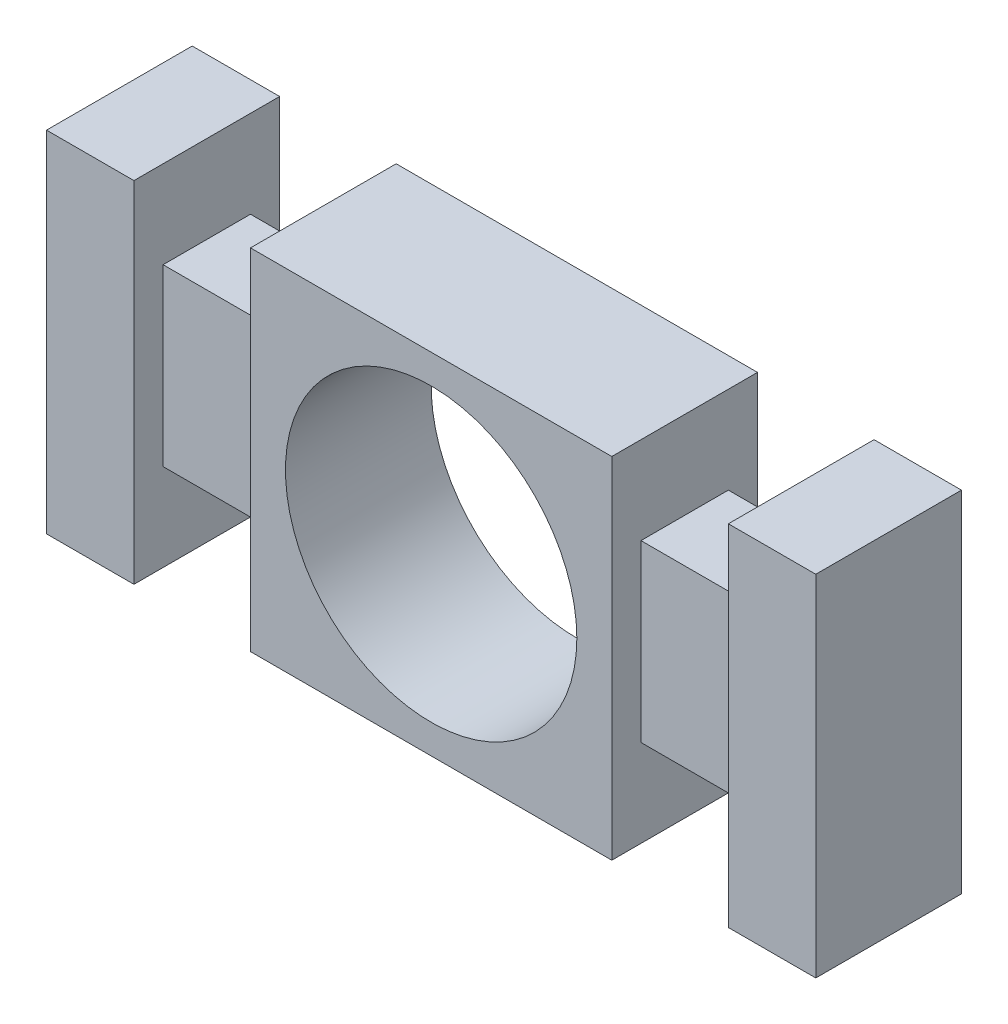
ISO-10303-21;
HEADER;
FILE_DESCRIPTION(('STEP AP214'),'2;1');
FILE_NAME('part.step','',(''),(''),'','','');
FILE_SCHEMA(('AUTOMOTIVE_DESIGN { 1 0 10303 214 1 1 1 1 }'));
ENDSEC;
DATA;
#1=APPLICATION_CONTEXT('core data for automotive mechanical design processes');
#2=APPLICATION_PROTOCOL_DEFINITION('international standard','automotive_design',2000,#1);
#3=PRODUCT_CONTEXT('',#1,'mechanical');
#4=PRODUCT('Part','Part','',(#3));
#5=PRODUCT_RELATED_PRODUCT_CATEGORY('part','',(#4));
#6=PRODUCT_DEFINITION_FORMATION('','',#4);
#7=PRODUCT_DEFINITION_CONTEXT('part definition',#1,'design');
#8=PRODUCT_DEFINITION('design','',#6,#7);
#9=PRODUCT_DEFINITION_SHAPE('','',#8);
#10=(LENGTH_UNIT() NAMED_UNIT(*) SI_UNIT(.MILLI.,.METRE.));
#11=(NAMED_UNIT(*) PLANE_ANGLE_UNIT() SI_UNIT($,.RADIAN.));
#12=(NAMED_UNIT(*) SI_UNIT($,.STERADIAN.) SOLID_ANGLE_UNIT());
#13=UNCERTAINTY_MEASURE_WITH_UNIT(LENGTH_MEASURE(1.E-05),#10,'distance_accuracy_value','');
#14=(GEOMETRIC_REPRESENTATION_CONTEXT(3) GLOBAL_UNCERTAINTY_ASSIGNED_CONTEXT((#13)) GLOBAL_UNIT_ASSIGNED_CONTEXT((#10,
#11,#12)) REPRESENTATION_CONTEXT('',''));
#15=CARTESIAN_POINT('',(0.,0.,0.));
#16=DIRECTION('',(0.,0.,1.));
#17=DIRECTION('',(1.,0.,0.));
#18=AXIS2_PLACEMENT_3D('',#15,#16,#17);
#19=CARTESIAN_POINT('',(-51.,15.,0.));
#20=DIRECTION('',(0.,-1.,0.));
#21=DIRECTION('',(1.,0.,0.));
#22=AXIS2_PLACEMENT_3D('',#19,#20,#21);
#23=PLANE('',#22);
#24=DIRECTION('',(1.,0.,0.));
#25=VECTOR('',#24,1.);
#26=CARTESIAN_POINT('',(-51.,15.,5.));
#27=LINE('',#26,#25);
#28=CARTESIAN_POINT('',(-51.,15.,5.));
#29=VERTEX_POINT('',#28);
#30=CARTESIAN_POINT('',(-31.,15.,5.));
#31=VERTEX_POINT('',#30);
#32=EDGE_CURVE('E188',#29,#31,#27,.T.);
#33=ORIENTED_EDGE('',*,*,#32,.F.);
#34=DIRECTION('',(0.,0.,1.));
#35=VECTOR('',#34,1.);
#36=CARTESIAN_POINT('',(-51.,15.,0.));
#37=LINE('',#36,#35);
#38=CARTESIAN_POINT('',(-51.,15.,20.));
#39=VERTEX_POINT('',#38);
#40=EDGE_CURVE('E199',#29,#39,#37,.T.);
#41=ORIENTED_EDGE('',*,*,#40,.T.);
#42=DIRECTION('',(-1.,0.,0.));
#43=VECTOR('',#42,1.);
#44=CARTESIAN_POINT('',(-51.,15.,20.));
#45=LINE('',#44,#43);
#46=CARTESIAN_POINT('',(-31.,15.,20.));
#47=VERTEX_POINT('',#46);
#48=EDGE_CURVE('E341',#47,#39,#45,.T.);
#49=ORIENTED_EDGE('',*,*,#48,.F.);
#50=DIRECTION('',(0.,0.,1.));
#51=VECTOR('',#50,1.);
#52=CARTESIAN_POINT('',(-31.,15.,0.));
#53=LINE('',#52,#51);
#54=EDGE_CURVE('E201',#31,#47,#53,.T.);
#55=ORIENTED_EDGE('',*,*,#54,.F.);
#56=EDGE_LOOP('',(#33,#41,#49,#55));
#57=FACE_BOUND('',#56,.T.);
#58=ADVANCED_FACE('F45',(#57),#23,.F.);
#59=CARTESIAN_POINT('',(-51.,-15.,0.));
#60=DIRECTION('',(0.,1.,0.));
#61=DIRECTION('',(-1.,0.,0.));
#62=AXIS2_PLACEMENT_3D('',#59,#60,#61);
#63=PLANE('',#62);
#64=DIRECTION('',(-1.,0.,0.));
#65=VECTOR('',#64,1.);
#66=CARTESIAN_POINT('',(-51.,-15.,5.));
#67=LINE('',#66,#65);
#68=CARTESIAN_POINT('',(-31.,-15.,5.));
#69=VERTEX_POINT('',#68);
#70=CARTESIAN_POINT('',(-51.,-15.,5.));
#71=VERTEX_POINT('',#70);
#72=EDGE_CURVE('E191',#69,#71,#67,.T.);
#73=ORIENTED_EDGE('',*,*,#72,.F.);
#74=DIRECTION('',(0.,0.,1.));
#75=VECTOR('',#74,1.);
#76=CARTESIAN_POINT('',(-31.,-15.,0.));
#77=LINE('',#76,#75);
#78=CARTESIAN_POINT('',(-31.,-15.,20.));
#79=VERTEX_POINT('',#78);
#80=EDGE_CURVE('E338',#69,#79,#77,.T.);
#81=ORIENTED_EDGE('',*,*,#80,.T.);
#82=DIRECTION('',(1.,0.,0.));
#83=VECTOR('',#82,1.);
#84=CARTESIAN_POINT('',(-51.,-15.,20.));
#85=LINE('',#84,#83);
#86=CARTESIAN_POINT('',(-51.,-15.,20.));
#87=VERTEX_POINT('',#86);
#88=EDGE_CURVE('E697',#87,#79,#85,.T.);
#89=ORIENTED_EDGE('',*,*,#88,.F.);
#90=DIRECTION('',(0.,0.,1.));
#91=VECTOR('',#90,1.);
#92=CARTESIAN_POINT('',(-51.,-15.,0.));
#93=LINE('',#92,#91);
#94=EDGE_CURVE('E327',#71,#87,#93,.T.);
#95=ORIENTED_EDGE('',*,*,#94,.F.);
#96=EDGE_LOOP('',(#73,#81,#89,#95));
#97=FACE_BOUND('',#96,.T.);
#98=ADVANCED_FACE('F434',(#97),#63,.F.);
#99=CARTESIAN_POINT('',(0.,0.,0.));
#100=DIRECTION('',(0.,0.,1.));
#101=DIRECTION('',(1.,0.,0.));
#102=AXIS2_PLACEMENT_3D('',#99,#100,#101);
#103=PLANE('',#102);
#104=DIRECTION('',(-1.,0.,0.));
#105=VECTOR('',#104,1.);
#106=CARTESIAN_POINT('',(-66.,30.,0.));
#107=LINE('',#106,#105);
#108=CARTESIAN_POINT('',(-51.,30.,0.));
#109=VERTEX_POINT('',#108);
#110=CARTESIAN_POINT('',(-66.,30.,0.));
#111=VERTEX_POINT('',#110);
#112=EDGE_CURVE('E251',#109,#111,#107,.T.);
#113=ORIENTED_EDGE('',*,*,#112,.F.);
#114=DIRECTION('',(0.,-1.,0.));
#115=VECTOR('',#114,1.);
#116=CARTESIAN_POINT('',(-51.,-30.,0.));
#117=LINE('',#116,#115);
#118=CARTESIAN_POINT('',(-51.,-30.,0.));
#119=VERTEX_POINT('',#118);
#120=EDGE_CURVE('E345',#109,#119,#117,.T.);
#121=ORIENTED_EDGE('',*,*,#120,.T.);
#122=DIRECTION('',(1.,0.,0.));
#123=VECTOR('',#122,1.);
#124=CARTESIAN_POINT('',(-66.,-30.,0.));
#125=LINE('',#124,#123);
#126=CARTESIAN_POINT('',(-66.,-30.,0.));
#127=VERTEX_POINT('',#126);
#128=EDGE_CURVE('E242',#127,#119,#125,.T.);
#129=ORIENTED_EDGE('',*,*,#128,.F.);
#130=DIRECTION('',(0.,-1.,0.));
#131=VECTOR('',#130,1.);
#132=CARTESIAN_POINT('',(-66.,-30.,0.));
#133=LINE('',#132,#131);
#134=EDGE_CURVE('E256',#111,#127,#133,.T.);
#135=ORIENTED_EDGE('',*,*,#134,.F.);
#136=EDGE_LOOP('',(#113,#121,#129,#135));
#137=FACE_BOUND('',#136,.T.);
#138=ADVANCED_FACE('F403',(#137),#103,.F.);
#139=DIRECTION('',(0.,1.,0.));
#140=VECTOR('',#139,1.);
#141=CARTESIAN_POINT('',(51.,-30.,0.));
#142=LINE('',#141,#140);
#143=CARTESIAN_POINT('',(51.,-30.,0.));
#144=VERTEX_POINT('',#143);
#145=CARTESIAN_POINT('',(51.,30.,0.));
#146=VERTEX_POINT('',#145);
#147=EDGE_CURVE('E281',#144,#146,#142,.T.);
#148=ORIENTED_EDGE('',*,*,#147,.T.);
#149=CARTESIAN_POINT('',(66.,30.,0.));
#150=VERTEX_POINT('',#149);
#151=EDGE_CURVE('E252',#150,#146,#107,.T.);
#152=ORIENTED_EDGE('',*,*,#151,.F.);
#153=DIRECTION('',(0.,1.,0.));
#154=VECTOR('',#153,1.);
#155=CARTESIAN_POINT('',(66.,-30.,0.));
#156=LINE('',#155,#154);
#157=CARTESIAN_POINT('',(66.,-30.,0.));
#158=VERTEX_POINT('',#157);
#159=EDGE_CURVE('E246',#158,#150,#156,.T.);
#160=ORIENTED_EDGE('',*,*,#159,.F.);
#161=EDGE_CURVE('E248',#144,#158,#125,.T.);
#162=ORIENTED_EDGE('',*,*,#161,.F.);
#163=EDGE_LOOP('',(#148,#152,#160,#162));
#164=FACE_BOUND('',#163,.T.);
#165=ADVANCED_FACE('F279',(#164),#103,.F.);
#166=CARTESIAN_POINT('',(0.,0.,25.));
#167=DIRECTION('',(0.,0.,1.));
#168=DIRECTION('',(1.,0.,0.));
#169=AXIS2_PLACEMENT_3D('',#166,#167,#168);
#170=PLANE('',#169);
#171=DIRECTION('',(0.,-1.,0.));
#172=VECTOR('',#171,1.);
#173=CARTESIAN_POINT('',(-51.,-30.,25.));
#174=LINE('',#173,#172);
#175=CARTESIAN_POINT('',(-51.,30.,25.));
#176=VERTEX_POINT('',#175);
#177=CARTESIAN_POINT('',(-51.,-30.,25.));
#178=VERTEX_POINT('',#177);
#179=EDGE_CURVE('E319',#176,#178,#174,.T.);
#180=ORIENTED_EDGE('',*,*,#179,.F.);
#181=DIRECTION('',(-1.,0.,0.));
#182=VECTOR('',#181,1.);
#183=CARTESIAN_POINT('',(-66.,30.,25.));
#184=LINE('',#183,#182);
#185=CARTESIAN_POINT('',(-66.,30.,25.));
#186=VERTEX_POINT('',#185);
#187=EDGE_CURVE('E232',#176,#186,#184,.T.);
#188=ORIENTED_EDGE('',*,*,#187,.T.);
#189=DIRECTION('',(0.,-1.,0.));
#190=VECTOR('',#189,1.);
#191=CARTESIAN_POINT('',(-66.,-30.,25.));
#192=LINE('',#191,#190);
#193=CARTESIAN_POINT('',(-66.,-30.,25.));
#194=VERTEX_POINT('',#193);
#195=EDGE_CURVE('E237',#186,#194,#192,.T.);
#196=ORIENTED_EDGE('',*,*,#195,.T.);
#197=DIRECTION('',(1.,0.,0.));
#198=VECTOR('',#197,1.);
#199=CARTESIAN_POINT('',(-66.,-30.,25.));
#200=LINE('',#199,#198);
#201=EDGE_CURVE('E223',#194,#178,#200,.T.);
#202=ORIENTED_EDGE('',*,*,#201,.T.);
#203=EDGE_LOOP('',(#180,#188,#196,#202));
#204=FACE_BOUND('',#203,.T.);
#205=ADVANCED_FACE('F389',(#204),#170,.T.);
#206=CARTESIAN_POINT('',(66.,30.,25.));
#207=VERTEX_POINT('',#206);
#208=CARTESIAN_POINT('',(51.,30.,25.));
#209=VERTEX_POINT('',#208);
#210=EDGE_CURVE('E233',#207,#209,#184,.T.);
#211=ORIENTED_EDGE('',*,*,#210,.T.);
#212=DIRECTION('',(0.,1.,0.));
#213=VECTOR('',#212,1.);
#214=CARTESIAN_POINT('',(51.,-30.,25.));
#215=LINE('',#214,#213);
#216=CARTESIAN_POINT('',(51.,-30.,25.));
#217=VERTEX_POINT('',#216);
#218=EDGE_CURVE('E292',#217,#209,#215,.T.);
#219=ORIENTED_EDGE('',*,*,#218,.F.);
#220=CARTESIAN_POINT('',(66.,-30.,25.));
#221=VERTEX_POINT('',#220);
#222=EDGE_CURVE('E229',#217,#221,#200,.T.);
#223=ORIENTED_EDGE('',*,*,#222,.T.);
#224=DIRECTION('',(0.,1.,0.));
#225=VECTOR('',#224,1.);
#226=CARTESIAN_POINT('',(66.,-30.,25.));
#227=LINE('',#226,#225);
#228=EDGE_CURVE('E227',#221,#207,#227,.T.);
#229=ORIENTED_EDGE('',*,*,#228,.T.);
#230=EDGE_LOOP('',(#211,#219,#223,#229));
#231=FACE_BOUND('',#230,.T.);
#232=ADVANCED_FACE('F445',(#231),#170,.T.);
#233=CARTESIAN_POINT('',(-66.,-30.,25.));
#234=DIRECTION('',(0.,1.,0.));
#235=DIRECTION('',(0.,0.,1.));
#236=AXIS2_PLACEMENT_3D('',#233,#234,#235);
#237=PLANE('',#236);
#238=CARTESIAN_POINT('',(-31.,-30.,25.));
#239=VERTEX_POINT('',#238);
#240=CARTESIAN_POINT('',(31.,-30.,25.));
#241=VERTEX_POINT('',#240);
#242=EDGE_CURVE('E228',#239,#241,#200,.T.);
#243=ORIENTED_EDGE('',*,*,#242,.F.);
#244=DIRECTION('',(0.,0.,1.));
#245=VECTOR('',#244,1.);
#246=CARTESIAN_POINT('',(-31.,-30.,0.));
#247=LINE('',#246,#245);
#248=CARTESIAN_POINT('',(-31.,-30.,0.));
#249=VERTEX_POINT('',#248);
#250=EDGE_CURVE('E335',#249,#239,#247,.T.);
#251=ORIENTED_EDGE('',*,*,#250,.F.);
#252=CARTESIAN_POINT('',(31.,-30.,0.));
#253=VERTEX_POINT('',#252);
#254=EDGE_CURVE('E247',#249,#253,#125,.T.);
#255=ORIENTED_EDGE('',*,*,#254,.T.);
#256=DIRECTION('',(0.,0.,1.));
#257=VECTOR('',#256,1.);
#258=CARTESIAN_POINT('',(31.,-30.,0.));
#259=LINE('',#258,#257);
#260=EDGE_CURVE('E312',#253,#241,#259,.T.);
#261=ORIENTED_EDGE('',*,*,#260,.T.);
#262=EDGE_LOOP('',(#243,#251,#255,#261));
#263=FACE_BOUND('',#262,.T.);
#264=ADVANCED_FACE('F371',(#263),#237,.F.);
#265=ORIENTED_EDGE('',*,*,#222,.F.);
#266=DIRECTION('',(0.,0.,1.));
#267=VECTOR('',#266,1.);
#268=CARTESIAN_POINT('',(51.,-30.,0.));
#269=LINE('',#268,#267);
#270=EDGE_CURVE('E316',#144,#217,#269,.T.);
#271=ORIENTED_EDGE('',*,*,#270,.F.);
#272=ORIENTED_EDGE('',*,*,#161,.T.);
#273=DIRECTION('',(0.,0.,-1.));
#274=VECTOR('',#273,1.);
#275=CARTESIAN_POINT('',(66.,-30.,25.));
#276=LINE('',#275,#274);
#277=EDGE_CURVE('E11',#221,#158,#276,.T.);
#278=ORIENTED_EDGE('',*,*,#277,.F.);
#279=EDGE_LOOP('',(#265,#271,#272,#278));
#280=FACE_BOUND('',#279,.T.);
#281=ADVANCED_FACE('F458',(#280),#237,.F.);
#282=CARTESIAN_POINT('',(-66.,30.,25.));
#283=DIRECTION('',(0.,-1.,0.));
#284=DIRECTION('',(0.,0.,-1.));
#285=AXIS2_PLACEMENT_3D('',#282,#283,#284);
#286=PLANE('',#285);
#287=CARTESIAN_POINT('',(31.,30.,25.));
#288=VERTEX_POINT('',#287);
#289=CARTESIAN_POINT('',(-31.,30.,25.));
#290=VERTEX_POINT('',#289);
#291=EDGE_CURVE('E238',#288,#290,#184,.T.);
#292=ORIENTED_EDGE('',*,*,#291,.F.);
#293=DIRECTION('',(0.,0.,1.));
#294=VECTOR('',#293,1.);
#295=CARTESIAN_POINT('',(31.,30.,0.));
#296=LINE('',#295,#294);
#297=CARTESIAN_POINT('',(31.,30.,0.));
#298=VERTEX_POINT('',#297);
#299=EDGE_CURVE('E294',#298,#288,#296,.T.);
#300=ORIENTED_EDGE('',*,*,#299,.F.);
#301=CARTESIAN_POINT('',(-31.,30.,0.));
#302=VERTEX_POINT('',#301);
#303=EDGE_CURVE('E257',#298,#302,#107,.T.);
#304=ORIENTED_EDGE('',*,*,#303,.T.);
#305=DIRECTION('',(0.,0.,1.));
#306=VECTOR('',#305,1.);
#307=CARTESIAN_POINT('',(-31.,30.,0.));
#308=LINE('',#307,#306);
#309=EDGE_CURVE('E216',#302,#290,#308,.T.);
#310=ORIENTED_EDGE('',*,*,#309,.T.);
#311=EDGE_LOOP('',(#292,#300,#304,#310));
#312=FACE_BOUND('',#311,.T.);
#313=ADVANCED_FACE('F379',(#312),#286,.F.);
#314=ORIENTED_EDGE('',*,*,#151,.T.);
#315=DIRECTION('',(0.,0.,1.));
#316=VECTOR('',#315,1.);
#317=CARTESIAN_POINT('',(51.,30.,0.));
#318=LINE('',#317,#316);
#319=EDGE_CURVE('E289',#146,#209,#318,.T.);
#320=ORIENTED_EDGE('',*,*,#319,.T.);
#321=ORIENTED_EDGE('',*,*,#210,.F.);
#322=DIRECTION('',(0.,0.,-1.));
#323=VECTOR('',#322,1.);
#324=CARTESIAN_POINT('',(66.,30.,25.));
#325=LINE('',#324,#323);
#326=EDGE_CURVE('E54',#207,#150,#325,.T.);
#327=ORIENTED_EDGE('',*,*,#326,.T.);
#328=EDGE_LOOP('',(#314,#320,#321,#327));
#329=FACE_BOUND('',#328,.T.);
#330=ADVANCED_FACE('F273',(#329),#286,.F.);
#331=ORIENTED_EDGE('',*,*,#128,.T.);
#332=DIRECTION('',(0.,0.,1.));
#333=VECTOR('',#332,1.);
#334=CARTESIAN_POINT('',(-51.,-30.,0.));
#335=LINE('',#334,#333);
#336=EDGE_CURVE('E331',#119,#178,#335,.T.);
#337=ORIENTED_EDGE('',*,*,#336,.T.);
#338=ORIENTED_EDGE('',*,*,#201,.F.);
#339=DIRECTION('',(0.,0.,-1.));
#340=VECTOR('',#339,1.);
#341=CARTESIAN_POINT('',(-66.,-30.,25.));
#342=LINE('',#341,#340);
#343=EDGE_CURVE('E241',#194,#127,#342,.T.);
#344=ORIENTED_EDGE('',*,*,#343,.T.);
#345=EDGE_LOOP('',(#331,#337,#338,#344));
#346=FACE_BOUND('',#345,.T.);
#347=ADVANCED_FACE('F47',(#346),#237,.F.);
#348=CARTESIAN_POINT('',(66.,-30.,25.));
#349=DIRECTION('',(-1.,0.,0.));
#350=DIRECTION('',(0.,0.,1.));
#351=AXIS2_PLACEMENT_3D('',#348,#349,#350);
#352=PLANE('',#351);
#353=ORIENTED_EDGE('',*,*,#159,.T.);
#354=ORIENTED_EDGE('',*,*,#326,.F.);
#355=ORIENTED_EDGE('',*,*,#228,.F.);
#356=ORIENTED_EDGE('',*,*,#277,.T.);
#357=EDGE_LOOP('',(#353,#354,#355,#356));
#358=FACE_BOUND('',#357,.T.);
#359=ADVANCED_FACE('F453',(#358),#352,.F.);
#360=ORIENTED_EDGE('',*,*,#187,.F.);
#361=DIRECTION('',(0.,0.,1.));
#362=VECTOR('',#361,1.);
#363=CARTESIAN_POINT('',(-51.,30.,0.));
#364=LINE('',#363,#362);
#365=EDGE_CURVE('E211',#109,#176,#364,.T.);
#366=ORIENTED_EDGE('',*,*,#365,.F.);
#367=ORIENTED_EDGE('',*,*,#112,.T.);
#368=DIRECTION('',(0.,0.,-1.));
#369=VECTOR('',#368,1.);
#370=CARTESIAN_POINT('',(-66.,30.,25.));
#371=LINE('',#370,#369);
#372=EDGE_CURVE('E263',#186,#111,#371,.T.);
#373=ORIENTED_EDGE('',*,*,#372,.F.);
#374=EDGE_LOOP('',(#360,#366,#367,#373));
#375=FACE_BOUND('',#374,.T.);
#376=ADVANCED_FACE('F394',(#375),#286,.F.);
#377=CARTESIAN_POINT('',(-66.,-30.,25.));
#378=DIRECTION('',(1.,0.,0.));
#379=DIRECTION('',(0.,0.,-1.));
#380=AXIS2_PLACEMENT_3D('',#377,#378,#379);
#381=PLANE('',#380);
#382=ORIENTED_EDGE('',*,*,#134,.T.);
#383=ORIENTED_EDGE('',*,*,#343,.F.);
#384=ORIENTED_EDGE('',*,*,#195,.F.);
#385=ORIENTED_EDGE('',*,*,#372,.T.);
#386=EDGE_LOOP('',(#382,#383,#384,#385));
#387=FACE_BOUND('',#386,.T.);
#388=ADVANCED_FACE('F398',(#387),#381,.F.);
#389=CARTESIAN_POINT('',(0.,0.,25.));
#390=DIRECTION('',(0.,0.,1.));
#391=DIRECTION('',(1.,0.,0.));
#392=AXIS2_PLACEMENT_3D('',#389,#390,#391);
#393=CIRCLE('',#392,25.);
#394=CARTESIAN_POINT('',(25.,0.,25.));
#395=VERTEX_POINT('',#394);
#396=EDGE_CURVE('E719',#395,#395,#393,.T.);
#397=ORIENTED_EDGE('',*,*,#396,.F.);
#398=EDGE_LOOP('',(#397));
#399=FACE_BOUND('',#398,.T.);
#400=ORIENTED_EDGE('',*,*,#291,.T.);
#401=DIRECTION('',(0.,1.,0.));
#402=VECTOR('',#401,1.);
#403=CARTESIAN_POINT('',(-31.,-15.,25.));
#404=LINE('',#403,#402);
#405=EDGE_CURVE('E342',#239,#290,#404,.T.);
#406=ORIENTED_EDGE('',*,*,#405,.F.);
#407=ORIENTED_EDGE('',*,*,#242,.T.);
#408=DIRECTION('',(0.,-1.,0.));
#409=VECTOR('',#408,1.);
#410=CARTESIAN_POINT('',(31.,-15.,25.));
#411=LINE('',#410,#409);
#412=EDGE_CURVE('E286',#288,#241,#411,.T.);
#413=ORIENTED_EDGE('',*,*,#412,.F.);
#414=EDGE_LOOP('',(#400,#406,#407,#413));
#415=FACE_BOUND('',#414,.T.);
#416=ADVANCED_FACE('F416',(#399,#415),#170,.T.);
#417=CARTESIAN_POINT('',(0.,0.,0.));
#418=DIRECTION('',(0.,0.,1.));
#419=DIRECTION('',(1.,0.,0.));
#420=AXIS2_PLACEMENT_3D('',#417,#418,#419);
#421=CIRCLE('',#420,25.);
#422=CARTESIAN_POINT('',(25.,0.,0.));
#423=VERTEX_POINT('',#422);
#424=EDGE_CURVE('E714',#423,#423,#421,.T.);
#425=ORIENTED_EDGE('',*,*,#424,.T.);
#426=EDGE_LOOP('',(#425));
#427=FACE_BOUND('',#426,.T.);
#428=DIRECTION('',(0.,1.,0.));
#429=VECTOR('',#428,1.);
#430=CARTESIAN_POINT('',(-31.,-15.,0.));
#431=LINE('',#430,#429);
#432=EDGE_CURVE('E330',#249,#302,#431,.T.);
#433=ORIENTED_EDGE('',*,*,#432,.T.);
#434=ORIENTED_EDGE('',*,*,#303,.F.);
#435=DIRECTION('',(0.,-1.,0.));
#436=VECTOR('',#435,1.);
#437=CARTESIAN_POINT('',(31.,-15.,0.));
#438=LINE('',#437,#436);
#439=EDGE_CURVE('E287',#298,#253,#438,.T.);
#440=ORIENTED_EDGE('',*,*,#439,.T.);
#441=ORIENTED_EDGE('',*,*,#254,.F.);
#442=EDGE_LOOP('',(#433,#434,#440,#441));
#443=FACE_BOUND('',#442,.T.);
#444=ADVANCED_FACE('F374',(#427,#443),#103,.F.);
#445=CARTESIAN_POINT('',(51.,15.,0.));
#446=DIRECTION('',(0.,-1.,0.));
#447=DIRECTION('',(1.,0.,0.));
#448=AXIS2_PLACEMENT_3D('',#445,#446,#447);
#449=PLANE('',#448);
#450=DIRECTION('',(0.,0.,1.));
#451=VECTOR('',#450,1.);
#452=CARTESIAN_POINT('',(51.,15.,0.));
#453=LINE('',#452,#451);
#454=CARTESIAN_POINT('',(51.,15.,5.));
#455=VERTEX_POINT('',#454);
#456=CARTESIAN_POINT('',(51.,15.,20.));
#457=VERTEX_POINT('',#456);
#458=EDGE_CURVE('E219',#455,#457,#453,.T.);
#459=ORIENTED_EDGE('',*,*,#458,.F.);
#460=DIRECTION('',(1.,0.,0.));
#461=VECTOR('',#460,1.);
#462=CARTESIAN_POINT('',(51.,15.,5.));
#463=LINE('',#462,#461);
#464=CARTESIAN_POINT('',(31.,15.,5.));
#465=VERTEX_POINT('',#464);
#466=EDGE_CURVE('E711',#465,#455,#463,.T.);
#467=ORIENTED_EDGE('',*,*,#466,.F.);
#468=DIRECTION('',(0.,0.,1.));
#469=VECTOR('',#468,1.);
#470=CARTESIAN_POINT('',(31.,15.,0.));
#471=LINE('',#470,#469);
#472=CARTESIAN_POINT('',(31.,15.,20.));
#473=VERTEX_POINT('',#472);
#474=EDGE_CURVE('E301',#465,#473,#471,.T.);
#475=ORIENTED_EDGE('',*,*,#474,.T.);
#476=DIRECTION('',(-1.,0.,0.));
#477=VECTOR('',#476,1.);
#478=CARTESIAN_POINT('',(51.,15.,20.));
#479=LINE('',#478,#477);
#480=EDGE_CURVE('E674',#457,#473,#479,.T.);
#481=ORIENTED_EDGE('',*,*,#480,.F.);
#482=EDGE_LOOP('',(#459,#467,#475,#481));
#483=FACE_BOUND('',#482,.T.);
#484=ADVANCED_FACE('F448',(#483),#449,.F.);
#485=CARTESIAN_POINT('',(51.,-30.,0.));
#486=DIRECTION('',(1.,0.,0.));
#487=DIRECTION('',(0.,0.,-1.));
#488=AXIS2_PLACEMENT_3D('',#485,#486,#487);
#489=PLANE('',#488);
#490=DIRECTION('',(0.,-1.,0.));
#491=VECTOR('',#490,1.);
#492=CARTESIAN_POINT('',(51.,-15.,5.));
#493=LINE('',#492,#491);
#494=CARTESIAN_POINT('',(51.,-15.,5.));
#495=VERTEX_POINT('',#494);
#496=EDGE_CURVE('E61',#455,#495,#493,.T.);
#497=ORIENTED_EDGE('',*,*,#496,.F.);
#498=ORIENTED_EDGE('',*,*,#458,.T.);
#499=DIRECTION('',(0.,1.,0.));
#500=VECTOR('',#499,1.);
#501=CARTESIAN_POINT('',(51.,15.,20.));
#502=LINE('',#501,#500);
#503=CARTESIAN_POINT('',(51.,-15.,20.));
#504=VERTEX_POINT('',#503);
#505=EDGE_CURVE('E672',#504,#457,#502,.T.);
#506=ORIENTED_EDGE('',*,*,#505,.F.);
#507=DIRECTION('',(0.,0.,1.));
#508=VECTOR('',#507,1.);
#509=CARTESIAN_POINT('',(51.,-15.,0.));
#510=LINE('',#509,#508);
#511=EDGE_CURVE('E307',#495,#504,#510,.T.);
#512=ORIENTED_EDGE('',*,*,#511,.F.);
#513=EDGE_LOOP('',(#497,#498,#506,#512));
#514=FACE_BOUND('',#513,.T.);
#515=ORIENTED_EDGE('',*,*,#218,.T.);
#516=ORIENTED_EDGE('',*,*,#319,.F.);
#517=ORIENTED_EDGE('',*,*,#147,.F.);
#518=ORIENTED_EDGE('',*,*,#270,.T.);
#519=EDGE_LOOP('',(#515,#516,#517,#518));
#520=FACE_BOUND('',#519,.T.);
#521=ADVANCED_FACE('F290',(#514,#520),#489,.F.);
#522=CARTESIAN_POINT('',(31.,-15.,0.));
#523=DIRECTION('',(-1.,0.,0.));
#524=DIRECTION('',(0.,-1.,0.));
#525=AXIS2_PLACEMENT_3D('',#522,#523,#524);
#526=PLANE('',#525);
#527=ORIENTED_EDGE('',*,*,#474,.F.);
#528=DIRECTION('',(0.,1.,0.));
#529=VECTOR('',#528,1.);
#530=CARTESIAN_POINT('',(31.,-15.,5.));
#531=LINE('',#530,#529);
#532=CARTESIAN_POINT('',(31.,-15.,5.));
#533=VERTEX_POINT('',#532);
#534=EDGE_CURVE('E708',#533,#465,#531,.T.);
#535=ORIENTED_EDGE('',*,*,#534,.F.);
#536=DIRECTION('',(0.,0.,1.));
#537=VECTOR('',#536,1.);
#538=CARTESIAN_POINT('',(31.,-15.,0.));
#539=LINE('',#538,#537);
#540=CARTESIAN_POINT('',(31.,-15.,20.));
#541=VERTEX_POINT('',#540);
#542=EDGE_CURVE('E69',#533,#541,#539,.T.);
#543=ORIENTED_EDGE('',*,*,#542,.T.);
#544=DIRECTION('',(0.,-1.,0.));
#545=VECTOR('',#544,1.);
#546=CARTESIAN_POINT('',(31.,15.,20.));
#547=LINE('',#546,#545);
#548=EDGE_CURVE('E683',#473,#541,#547,.T.);
#549=ORIENTED_EDGE('',*,*,#548,.F.);
#550=EDGE_LOOP('',(#527,#535,#543,#549));
#551=FACE_BOUND('',#550,.T.);
#552=ORIENTED_EDGE('',*,*,#412,.T.);
#553=ORIENTED_EDGE('',*,*,#260,.F.);
#554=ORIENTED_EDGE('',*,*,#439,.F.);
#555=ORIENTED_EDGE('',*,*,#299,.T.);
#556=EDGE_LOOP('',(#552,#553,#554,#555));
#557=FACE_BOUND('',#556,.T.);
#558=ADVANCED_FACE('F378',(#551,#557),#526,.F.);
#559=CARTESIAN_POINT('',(51.,-15.,0.));
#560=DIRECTION('',(0.,1.,0.));
#561=DIRECTION('',(-1.,0.,0.));
#562=AXIS2_PLACEMENT_3D('',#559,#560,#561);
#563=PLANE('',#562);
#564=ORIENTED_EDGE('',*,*,#542,.F.);
#565=DIRECTION('',(-1.,0.,0.));
#566=VECTOR('',#565,1.);
#567=CARTESIAN_POINT('',(51.,-15.,5.));
#568=LINE('',#567,#566);
#569=EDGE_CURVE('E705',#495,#533,#568,.T.);
#570=ORIENTED_EDGE('',*,*,#569,.F.);
#571=ORIENTED_EDGE('',*,*,#511,.T.);
#572=DIRECTION('',(1.,0.,0.));
#573=VECTOR('',#572,1.);
#574=CARTESIAN_POINT('',(51.,-15.,20.));
#575=LINE('',#574,#573);
#576=EDGE_CURVE('E676',#541,#504,#575,.T.);
#577=ORIENTED_EDGE('',*,*,#576,.F.);
#578=EDGE_LOOP('',(#564,#570,#571,#577));
#579=FACE_BOUND('',#578,.T.);
#580=ADVANCED_FACE('F420',(#579),#563,.F.);
#581=CARTESIAN_POINT('',(-31.,-15.,0.));
#582=DIRECTION('',(1.,0.,0.));
#583=DIRECTION('',(0.,1.,0.));
#584=AXIS2_PLACEMENT_3D('',#581,#582,#583);
#585=PLANE('',#584);
#586=ORIENTED_EDGE('',*,*,#80,.F.);
#587=DIRECTION('',(0.,-1.,0.));
#588=VECTOR('',#587,1.);
#589=CARTESIAN_POINT('',(-31.,-15.,5.));
#590=LINE('',#589,#588);
#591=EDGE_CURVE('E203',#31,#69,#590,.T.);
#592=ORIENTED_EDGE('',*,*,#591,.F.);
#593=ORIENTED_EDGE('',*,*,#54,.T.);
#594=DIRECTION('',(0.,1.,0.));
#595=VECTOR('',#594,1.);
#596=CARTESIAN_POINT('',(-31.,15.,20.));
#597=LINE('',#596,#595);
#598=EDGE_CURVE('E693',#79,#47,#597,.T.);
#599=ORIENTED_EDGE('',*,*,#598,.F.);
#600=EDGE_LOOP('',(#586,#592,#593,#599));
#601=FACE_BOUND('',#600,.T.);
#602=ORIENTED_EDGE('',*,*,#405,.T.);
#603=ORIENTED_EDGE('',*,*,#309,.F.);
#604=ORIENTED_EDGE('',*,*,#432,.F.);
#605=ORIENTED_EDGE('',*,*,#250,.T.);
#606=EDGE_LOOP('',(#602,#603,#604,#605));
#607=FACE_BOUND('',#606,.T.);
#608=ADVANCED_FACE('F418',(#601,#607),#585,.F.);
#609=CARTESIAN_POINT('',(-51.,-30.,0.));
#610=DIRECTION('',(-1.,0.,0.));
#611=DIRECTION('',(0.,0.,1.));
#612=AXIS2_PLACEMENT_3D('',#609,#610,#611);
#613=PLANE('',#612);
#614=DIRECTION('',(0.,1.,0.));
#615=VECTOR('',#614,1.);
#616=CARTESIAN_POINT('',(-51.,-15.,5.));
#617=LINE('',#616,#615);
#618=EDGE_CURVE('E185',#71,#29,#617,.T.);
#619=ORIENTED_EDGE('',*,*,#618,.F.);
#620=ORIENTED_EDGE('',*,*,#94,.T.);
#621=DIRECTION('',(0.,-1.,0.));
#622=VECTOR('',#621,1.);
#623=CARTESIAN_POINT('',(-51.,15.,20.));
#624=LINE('',#623,#622);
#625=EDGE_CURVE('E208',#39,#87,#624,.T.);
#626=ORIENTED_EDGE('',*,*,#625,.F.);
#627=ORIENTED_EDGE('',*,*,#40,.F.);
#628=EDGE_LOOP('',(#619,#620,#626,#627));
#629=FACE_BOUND('',#628,.T.);
#630=ORIENTED_EDGE('',*,*,#179,.T.);
#631=ORIENTED_EDGE('',*,*,#336,.F.);
#632=ORIENTED_EDGE('',*,*,#120,.F.);
#633=ORIENTED_EDGE('',*,*,#365,.T.);
#634=EDGE_LOOP('',(#630,#631,#632,#633));
#635=FACE_BOUND('',#634,.T.);
#636=ADVANCED_FACE('F205',(#629,#635),#613,.F.);
#637=CARTESIAN_POINT('',(0.,0.,20.));
#638=DIRECTION('',(0.,0.,1.));
#639=DIRECTION('',(1.,0.,0.));
#640=AXIS2_PLACEMENT_3D('',#637,#638,#639);
#641=PLANE('',#640);
#642=ORIENTED_EDGE('',*,*,#625,.T.);
#643=ORIENTED_EDGE('',*,*,#88,.T.);
#644=ORIENTED_EDGE('',*,*,#598,.T.);
#645=ORIENTED_EDGE('',*,*,#48,.T.);
#646=EDGE_LOOP('',(#642,#643,#644,#645));
#647=FACE_BOUND('',#646,.T.);
#648=ADVANCED_FACE('F427',(#647),#641,.T.);
#649=CARTESIAN_POINT('',(0.,0.,20.));
#650=DIRECTION('',(0.,0.,-1.));
#651=DIRECTION('',(-1.,0.,0.));
#652=AXIS2_PLACEMENT_3D('',#649,#650,#651);
#653=PLANE('',#652);
#654=ORIENTED_EDGE('',*,*,#505,.T.);
#655=ORIENTED_EDGE('',*,*,#480,.T.);
#656=ORIENTED_EDGE('',*,*,#548,.T.);
#657=ORIENTED_EDGE('',*,*,#576,.T.);
#658=EDGE_LOOP('',(#654,#655,#656,#657));
#659=FACE_BOUND('',#658,.T.);
#660=ADVANCED_FACE('F534',(#659),#653,.F.);
#661=CARTESIAN_POINT('',(0.,0.,5.));
#662=DIRECTION('',(0.,0.,-1.));
#663=DIRECTION('',(-1.,0.,0.));
#664=AXIS2_PLACEMENT_3D('',#661,#662,#663);
#665=PLANE('',#664);
#666=ORIENTED_EDGE('',*,*,#618,.T.);
#667=ORIENTED_EDGE('',*,*,#32,.T.);
#668=ORIENTED_EDGE('',*,*,#591,.T.);
#669=ORIENTED_EDGE('',*,*,#72,.T.);
#670=EDGE_LOOP('',(#666,#667,#668,#669));
#671=FACE_BOUND('',#670,.T.);
#672=ADVANCED_FACE('F187',(#671),#665,.T.);
#673=CARTESIAN_POINT('',(0.,0.,5.));
#674=DIRECTION('',(0.,0.,1.));
#675=DIRECTION('',(1.,0.,0.));
#676=AXIS2_PLACEMENT_3D('',#673,#674,#675);
#677=PLANE('',#676);
#678=ORIENTED_EDGE('',*,*,#496,.T.);
#679=ORIENTED_EDGE('',*,*,#569,.T.);
#680=ORIENTED_EDGE('',*,*,#534,.T.);
#681=ORIENTED_EDGE('',*,*,#466,.T.);
#682=EDGE_LOOP('',(#678,#679,#680,#681));
#683=FACE_BOUND('',#682,.T.);
#684=ADVANCED_FACE('F533',(#683),#677,.F.);
#685=CARTESIAN_POINT('',(0.,0.,0.));
#686=DIRECTION('',(0.,0.,1.));
#687=DIRECTION('',(1.,0.,0.));
#688=AXIS2_PLACEMENT_3D('',#685,#686,#687);
#689=CYLINDRICAL_SURFACE('',#688,25.);
#690=ORIENTED_EDGE('',*,*,#424,.F.);
#691=EDGE_LOOP('',(#690));
#692=FACE_BOUND('',#691,.T.);
#693=ORIENTED_EDGE('',*,*,#396,.T.);
#694=EDGE_LOOP('',(#693));
#695=FACE_BOUND('',#694,.T.);
#696=ADVANCED_FACE('F543',(#692,#695),#689,.F.);
#697=CLOSED_SHELL('',(#58,#98,#138,#165,#205,#232,#264,#281,#313,#330,#347,#359,#376,#388,#416,
#444,#484,#521,#558,#580,#608,#636,#648,#660,#672,#684,#696));
#698=MANIFOLD_SOLID_BREP('B2',#697);
#699=ADVANCED_BREP_SHAPE_REPRESENTATION('',(#18,#698),#14);
#700=SHAPE_DEFINITION_REPRESENTATION(#9,#699);
ENDSEC;
END-ISO-10303-21;
